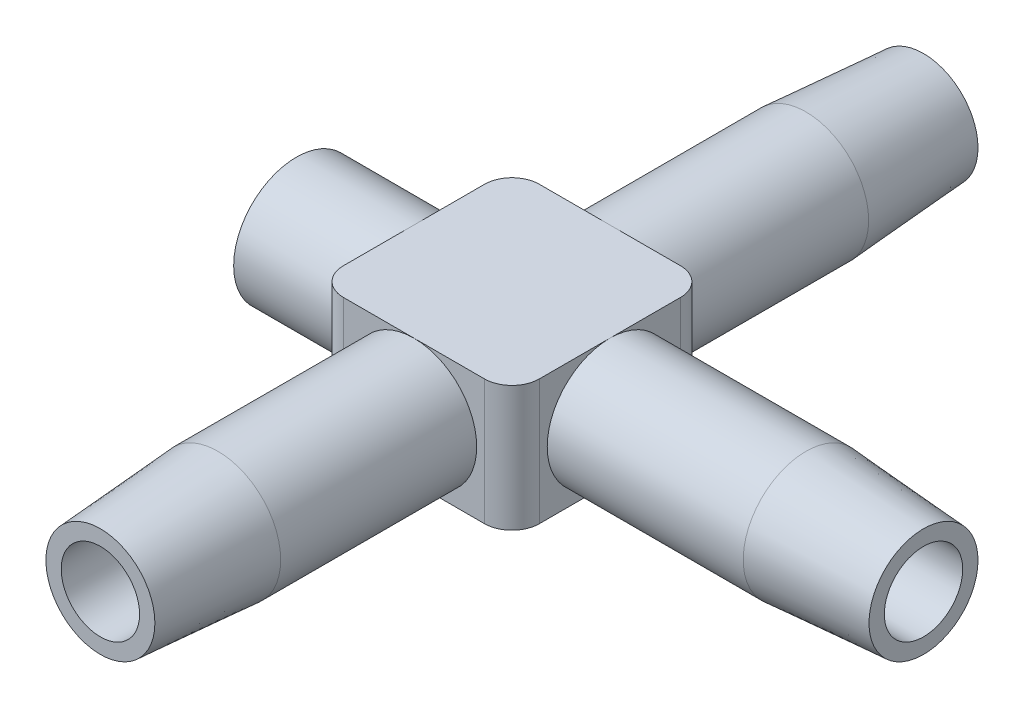
ISO-10303-21;
HEADER;
FILE_DESCRIPTION(('STEP AP214'),'2;1');
FILE_NAME('part.step','',(''),(''),'','','');
FILE_SCHEMA(('AUTOMOTIVE_DESIGN { 1 0 10303 214 1 1 1 1 }'));
ENDSEC;
DATA;
#1=APPLICATION_CONTEXT('core data for automotive mechanical design processes');
#2=APPLICATION_PROTOCOL_DEFINITION('international standard','automotive_design',2000,#1);
#3=PRODUCT_CONTEXT('',#1,'mechanical');
#4=PRODUCT('Part','Part','',(#3));
#5=PRODUCT_RELATED_PRODUCT_CATEGORY('part','',(#4));
#6=PRODUCT_DEFINITION_FORMATION('','',#4);
#7=PRODUCT_DEFINITION_CONTEXT('part definition',#1,'design');
#8=PRODUCT_DEFINITION('design','',#6,#7);
#9=PRODUCT_DEFINITION_SHAPE('','',#8);
#10=(LENGTH_UNIT() NAMED_UNIT(*) SI_UNIT(.MILLI.,.METRE.));
#11=(NAMED_UNIT(*) PLANE_ANGLE_UNIT() SI_UNIT($,.RADIAN.));
#12=(NAMED_UNIT(*) SI_UNIT($,.STERADIAN.) SOLID_ANGLE_UNIT());
#13=UNCERTAINTY_MEASURE_WITH_UNIT(LENGTH_MEASURE(1.E-05),#10,'distance_accuracy_value','');
#14=(GEOMETRIC_REPRESENTATION_CONTEXT(3) GLOBAL_UNCERTAINTY_ASSIGNED_CONTEXT((#13)) GLOBAL_UNIT_ASSIGNED_CONTEXT((#10,
#11,#12)) REPRESENTATION_CONTEXT('',''));
#15=CARTESIAN_POINT('',(0.,0.,0.));
#16=DIRECTION('',(0.,0.,1.));
#17=DIRECTION('',(1.,0.,0.));
#18=AXIS2_PLACEMENT_3D('',#15,#16,#17);
#19=CARTESIAN_POINT('',(-5.,6.4,-5.));
#20=DIRECTION('',(1.,0.,0.));
#21=DIRECTION('',(0.,0.,-1.));
#22=AXIS2_PLACEMENT_3D('',#19,#20,#21);
#23=PLANE('',#22);
#24=CARTESIAN_POINT('',(-5.,3.2,0.));
#25=DIRECTION('',(-1.,0.,0.));
#26=DIRECTION('',(0.,0.,1.));
#27=AXIS2_PLACEMENT_3D('',#24,#25,#26);
#28=CIRCLE('',#27,3.2);
#29=CARTESIAN_POINT('',(-5.,0.,0.));
#30=VERTEX_POINT('',#29);
#31=CARTESIAN_POINT('',(-5.,6.4,0.));
#32=VERTEX_POINT('',#31);
#33=EDGE_CURVE('E155',#30,#32,#28,.T.);
#34=ORIENTED_EDGE('',*,*,#33,.F.);
#35=DIRECTION('',(0.,0.,1.));
#36=VECTOR('',#35,1.);
#37=CARTESIAN_POINT('',(-5.,0.,-5.));
#38=LINE('',#37,#36);
#39=CARTESIAN_POINT('',(-5.,0.,3.6));
#40=VERTEX_POINT('',#39);
#41=EDGE_CURVE('E142',#30,#40,#38,.T.);
#42=ORIENTED_EDGE('',*,*,#41,.T.);
#43=DIRECTION('',(0.,-1.,0.));
#44=VECTOR('',#43,1.);
#45=CARTESIAN_POINT('',(-5.,6.4,3.6));
#46=LINE('',#45,#44);
#47=CARTESIAN_POINT('',(-5.,6.4,3.6));
#48=VERTEX_POINT('',#47);
#49=EDGE_CURVE('E268',#40,#48,#46,.F.);
#50=ORIENTED_EDGE('',*,*,#49,.T.);
#51=DIRECTION('',(0.,0.,1.));
#52=VECTOR('',#51,1.);
#53=CARTESIAN_POINT('',(-5.,6.4,-5.));
#54=LINE('',#53,#52);
#55=EDGE_CURVE('E156',#32,#48,#54,.T.);
#56=ORIENTED_EDGE('',*,*,#55,.F.);
#57=EDGE_LOOP('',(#34,#42,#50,#56));
#58=FACE_BOUND('',#57,.T.);
#59=ADVANCED_FACE('F39',(#58),#23,.F.);
#60=CARTESIAN_POINT('',(-5.,6.4,-5.));
#61=DIRECTION('',(0.,0.,1.));
#62=DIRECTION('',(1.,0.,0.));
#63=AXIS2_PLACEMENT_3D('',#60,#61,#62);
#64=PLANE('',#63);
#65=DIRECTION('',(-1.,0.,0.));
#66=VECTOR('',#65,1.);
#67=CARTESIAN_POINT('',(-5.,0.,-5.));
#68=LINE('',#67,#66);
#69=CARTESIAN_POINT('',(0.,0.,-5.));
#70=VERTEX_POINT('',#69);
#71=CARTESIAN_POINT('',(-3.6,0.,-5.));
#72=VERTEX_POINT('',#71);
#73=EDGE_CURVE('E247',#70,#72,#68,.T.);
#74=ORIENTED_EDGE('',*,*,#73,.T.);
#75=DIRECTION('',(0.,-1.,0.));
#76=VECTOR('',#75,1.);
#77=CARTESIAN_POINT('',(-3.6,6.4,-5.));
#78=LINE('',#77,#76);
#79=CARTESIAN_POINT('',(-3.6,6.4,-5.));
#80=VERTEX_POINT('',#79);
#81=EDGE_CURVE('E283',#72,#80,#78,.F.);
#82=ORIENTED_EDGE('',*,*,#81,.T.);
#83=DIRECTION('',(-1.,0.,0.));
#84=VECTOR('',#83,1.);
#85=CARTESIAN_POINT('',(-5.,6.4,-5.));
#86=LINE('',#85,#84);
#87=CARTESIAN_POINT('',(0.,6.4,-5.));
#88=VERTEX_POINT('',#87);
#89=EDGE_CURVE('E236',#88,#80,#86,.T.);
#90=ORIENTED_EDGE('',*,*,#89,.F.);
#91=CARTESIAN_POINT('',(0.,3.2,-5.));
#92=DIRECTION('',(0.,0.,1.));
#93=DIRECTION('',(1.,0.,0.));
#94=AXIS2_PLACEMENT_3D('',#91,#92,#93);
#95=CIRCLE('',#94,3.2);
#96=EDGE_CURVE('E195',#88,#70,#95,.T.);
#97=ORIENTED_EDGE('',*,*,#96,.T.);
#98=EDGE_LOOP('',(#74,#82,#90,#97));
#99=FACE_BOUND('',#98,.T.);
#100=ADVANCED_FACE('F349',(#99),#64,.F.);
#101=CARTESIAN_POINT('',(5.,6.4,-5.));
#102=DIRECTION('',(-1.,0.,0.));
#103=DIRECTION('',(0.,0.,1.));
#104=AXIS2_PLACEMENT_3D('',#101,#102,#103);
#105=PLANE('',#104);
#106=DIRECTION('',(0.,0.,-1.));
#107=VECTOR('',#106,1.);
#108=CARTESIAN_POINT('',(5.,6.4,-5.));
#109=LINE('',#108,#107);
#110=CARTESIAN_POINT('',(5.,6.4,3.6));
#111=VERTEX_POINT('',#110);
#112=CARTESIAN_POINT('',(5.,6.4,0.));
#113=VERTEX_POINT('',#112);
#114=EDGE_CURVE('E233',#111,#113,#109,.T.);
#115=ORIENTED_EDGE('',*,*,#114,.F.);
#116=DIRECTION('',(0.,-1.,0.));
#117=VECTOR('',#116,1.);
#118=CARTESIAN_POINT('',(5.,6.4,3.6));
#119=LINE('',#118,#117);
#120=CARTESIAN_POINT('',(5.,0.,3.6));
#121=VERTEX_POINT('',#120);
#122=EDGE_CURVE('E48',#111,#121,#119,.T.);
#123=ORIENTED_EDGE('',*,*,#122,.T.);
#124=DIRECTION('',(0.,0.,-1.));
#125=VECTOR('',#124,1.);
#126=CARTESIAN_POINT('',(5.,0.,-5.));
#127=LINE('',#126,#125);
#128=CARTESIAN_POINT('',(5.,0.,0.));
#129=VERTEX_POINT('',#128);
#130=EDGE_CURVE('E244',#121,#129,#127,.T.);
#131=ORIENTED_EDGE('',*,*,#130,.T.);
#132=CARTESIAN_POINT('',(5.,3.2,0.));
#133=DIRECTION('',(1.,0.,0.));
#134=DIRECTION('',(0.,0.,-1.));
#135=AXIS2_PLACEMENT_3D('',#132,#133,#134);
#136=CIRCLE('',#135,3.2);
#137=EDGE_CURVE('E208',#113,#129,#136,.T.);
#138=ORIENTED_EDGE('',*,*,#137,.F.);
#139=EDGE_LOOP('',(#115,#123,#131,#138));
#140=FACE_BOUND('',#139,.T.);
#141=ADVANCED_FACE('F298',(#140),#105,.F.);
#142=CARTESIAN_POINT('',(-5.,6.4,5.));
#143=DIRECTION('',(0.,0.,-1.));
#144=DIRECTION('',(-1.,0.,0.));
#145=AXIS2_PLACEMENT_3D('',#142,#143,#144);
#146=PLANE('',#145);
#147=DIRECTION('',(1.,0.,0.));
#148=VECTOR('',#147,1.);
#149=CARTESIAN_POINT('',(-5.,6.4,5.));
#150=LINE('',#149,#148);
#151=CARTESIAN_POINT('',(-3.6,6.4,5.));
#152=VERTEX_POINT('',#151);
#153=CARTESIAN_POINT('',(0.,6.4,5.));
#154=VERTEX_POINT('',#153);
#155=EDGE_CURVE('E229',#152,#154,#150,.T.);
#156=ORIENTED_EDGE('',*,*,#155,.F.);
#157=DIRECTION('',(0.,-1.,0.));
#158=VECTOR('',#157,1.);
#159=CARTESIAN_POINT('',(-3.6,6.4,5.));
#160=LINE('',#159,#158);
#161=CARTESIAN_POINT('',(-3.6,0.,5.));
#162=VERTEX_POINT('',#161);
#163=EDGE_CURVE('E251',#152,#162,#160,.T.);
#164=ORIENTED_EDGE('',*,*,#163,.T.);
#165=DIRECTION('',(1.,0.,0.));
#166=VECTOR('',#165,1.);
#167=CARTESIAN_POINT('',(-5.,0.,5.));
#168=LINE('',#167,#166);
#169=CARTESIAN_POINT('',(0.,0.,5.));
#170=VERTEX_POINT('',#169);
#171=EDGE_CURVE('E240',#162,#170,#168,.T.);
#172=ORIENTED_EDGE('',*,*,#171,.T.);
#173=CARTESIAN_POINT('',(0.,3.2,5.));
#174=DIRECTION('',(0.,0.,1.));
#175=DIRECTION('',(1.,0.,0.));
#176=AXIS2_PLACEMENT_3D('',#173,#174,#175);
#177=CIRCLE('',#176,3.2);
#178=EDGE_CURVE('E213',#154,#170,#177,.T.);
#179=ORIENTED_EDGE('',*,*,#178,.F.);
#180=EDGE_LOOP('',(#156,#164,#172,#179));
#181=FACE_BOUND('',#180,.T.);
#182=ADVANCED_FACE('F383',(#181),#146,.F.);
#183=EDGE_CURVE('E55',#32,#30,#28,.T.);
#184=ORIENTED_EDGE('',*,*,#183,.F.);
#185=CARTESIAN_POINT('',(-5.,6.4,-3.6));
#186=VERTEX_POINT('',#185);
#187=EDGE_CURVE('E225',#186,#32,#54,.T.);
#188=ORIENTED_EDGE('',*,*,#187,.F.);
#189=DIRECTION('',(0.,-1.,0.));
#190=VECTOR('',#189,1.);
#191=CARTESIAN_POINT('',(-5.,6.4,-3.6));
#192=LINE('',#191,#190);
#193=CARTESIAN_POINT('',(-5.,0.,-3.6));
#194=VERTEX_POINT('',#193);
#195=EDGE_CURVE('E138',#186,#194,#192,.T.);
#196=ORIENTED_EDGE('',*,*,#195,.T.);
#197=EDGE_CURVE('E134',#194,#30,#38,.T.);
#198=ORIENTED_EDGE('',*,*,#197,.T.);
#199=EDGE_LOOP('',(#184,#188,#196,#198));
#200=FACE_BOUND('',#199,.T.);
#201=ADVANCED_FACE('F136',(#200),#23,.F.);
#202=CARTESIAN_POINT('',(3.6,0.,5.));
#203=VERTEX_POINT('',#202);
#204=EDGE_CURVE('E141',#170,#203,#168,.T.);
#205=ORIENTED_EDGE('',*,*,#204,.T.);
#206=DIRECTION('',(0.,-1.,0.));
#207=VECTOR('',#206,1.);
#208=CARTESIAN_POINT('',(3.6,6.4,5.));
#209=LINE('',#208,#207);
#210=CARTESIAN_POINT('',(3.6,6.4,5.));
#211=VERTEX_POINT('',#210);
#212=EDGE_CURVE('E11',#203,#211,#209,.F.);
#213=ORIENTED_EDGE('',*,*,#212,.T.);
#214=EDGE_CURVE('E228',#154,#211,#150,.T.);
#215=ORIENTED_EDGE('',*,*,#214,.F.);
#216=EDGE_CURVE('E224',#170,#154,#177,.T.);
#217=ORIENTED_EDGE('',*,*,#216,.F.);
#218=EDGE_LOOP('',(#205,#213,#215,#217));
#219=FACE_BOUND('',#218,.T.);
#220=ADVANCED_FACE('F326',(#219),#146,.F.);
#221=CARTESIAN_POINT('',(5.,0.,-3.6));
#222=VERTEX_POINT('',#221);
#223=EDGE_CURVE('E243',#129,#222,#127,.T.);
#224=ORIENTED_EDGE('',*,*,#223,.T.);
#225=DIRECTION('',(0.,-1.,0.));
#226=VECTOR('',#225,1.);
#227=CARTESIAN_POINT('',(5.,6.4,-3.6));
#228=LINE('',#227,#226);
#229=CARTESIAN_POINT('',(5.,6.4,-3.6));
#230=VERTEX_POINT('',#229);
#231=EDGE_CURVE('E290',#222,#230,#228,.F.);
#232=ORIENTED_EDGE('',*,*,#231,.T.);
#233=EDGE_CURVE('E232',#113,#230,#109,.T.);
#234=ORIENTED_EDGE('',*,*,#233,.F.);
#235=EDGE_CURVE('E217',#129,#113,#136,.T.);
#236=ORIENTED_EDGE('',*,*,#235,.F.);
#237=EDGE_LOOP('',(#224,#232,#234,#236));
#238=FACE_BOUND('',#237,.T.);
#239=ADVANCED_FACE('F359',(#238),#105,.F.);
#240=CARTESIAN_POINT('',(3.6,6.4,-5.));
#241=VERTEX_POINT('',#240);
#242=EDGE_CURVE('E237',#241,#88,#86,.T.);
#243=ORIENTED_EDGE('',*,*,#242,.F.);
#244=DIRECTION('',(0.,-1.,0.));
#245=VECTOR('',#244,1.);
#246=CARTESIAN_POINT('',(3.6,6.4,-5.));
#247=LINE('',#246,#245);
#248=CARTESIAN_POINT('',(3.6,0.,-5.));
#249=VERTEX_POINT('',#248);
#250=EDGE_CURVE('E286',#241,#249,#247,.T.);
#251=ORIENTED_EDGE('',*,*,#250,.T.);
#252=EDGE_CURVE('E248',#249,#70,#68,.T.);
#253=ORIENTED_EDGE('',*,*,#252,.T.);
#254=EDGE_CURVE('E200',#70,#88,#95,.T.);
#255=ORIENTED_EDGE('',*,*,#254,.T.);
#256=EDGE_LOOP('',(#243,#251,#253,#255));
#257=FACE_BOUND('',#256,.T.);
#258=ADVANCED_FACE('F354',(#257),#64,.F.);
#259=CARTESIAN_POINT('',(0.,6.4,0.));
#260=DIRECTION('',(0.,1.,0.));
#261=DIRECTION('',(0.,0.,1.));
#262=AXIS2_PLACEMENT_3D('',#259,#260,#261);
#263=PLANE('',#262);
#264=ORIENTED_EDGE('',*,*,#187,.T.);
#265=ORIENTED_EDGE('',*,*,#55,.T.);
#266=CARTESIAN_POINT('',(-3.6,6.4,3.6));
#267=DIRECTION('',(0.,1.,0.));
#268=DIRECTION('',(0.,0.,1.));
#269=AXIS2_PLACEMENT_3D('',#266,#267,#268);
#270=CIRCLE('',#269,1.4);
#271=EDGE_CURVE('E280',#48,#152,#270,.T.);
#272=ORIENTED_EDGE('',*,*,#271,.T.);
#273=ORIENTED_EDGE('',*,*,#155,.T.);
#274=ORIENTED_EDGE('',*,*,#214,.T.);
#275=CARTESIAN_POINT('',(3.6,6.4,3.6));
#276=DIRECTION('',(0.,1.,0.));
#277=DIRECTION('',(0.,0.,1.));
#278=AXIS2_PLACEMENT_3D('',#275,#276,#277);
#279=CIRCLE('',#278,1.4);
#280=EDGE_CURVE('E271',#211,#111,#279,.T.);
#281=ORIENTED_EDGE('',*,*,#280,.T.);
#282=ORIENTED_EDGE('',*,*,#114,.T.);
#283=ORIENTED_EDGE('',*,*,#233,.T.);
#284=CARTESIAN_POINT('',(3.6,6.4,-3.6));
#285=DIRECTION('',(0.,1.,0.));
#286=DIRECTION('',(0.,0.,1.));
#287=AXIS2_PLACEMENT_3D('',#284,#285,#286);
#288=CIRCLE('',#287,1.4);
#289=EDGE_CURVE('E274',#230,#241,#288,.T.);
#290=ORIENTED_EDGE('',*,*,#289,.T.);
#291=ORIENTED_EDGE('',*,*,#242,.T.);
#292=ORIENTED_EDGE('',*,*,#89,.T.);
#293=CARTESIAN_POINT('',(-3.6,6.4,-3.6));
#294=DIRECTION('',(0.,1.,0.));
#295=DIRECTION('',(0.,0.,1.));
#296=AXIS2_PLACEMENT_3D('',#293,#294,#295);
#297=CIRCLE('',#296,1.4);
#298=EDGE_CURVE('E277',#80,#186,#297,.T.);
#299=ORIENTED_EDGE('',*,*,#298,.T.);
#300=EDGE_LOOP('',(#264,#265,#272,#273,#274,#281,#282,#283,#290,#291,#292,#299));
#301=FACE_BOUND('',#300,.T.);
#302=ADVANCED_FACE('F341',(#301),#263,.T.);
#303=CARTESIAN_POINT('',(0.,0.,0.));
#304=DIRECTION('',(0.,1.,0.));
#305=DIRECTION('',(0.,0.,1.));
#306=AXIS2_PLACEMENT_3D('',#303,#304,#305);
#307=PLANE('',#306);
#308=ORIENTED_EDGE('',*,*,#171,.F.);
#309=CARTESIAN_POINT('',(-3.6,0.,3.6));
#310=DIRECTION('',(0.,1.,0.));
#311=DIRECTION('',(0.,0.,1.));
#312=AXIS2_PLACEMENT_3D('',#309,#310,#311);
#313=CIRCLE('',#312,1.4);
#314=EDGE_CURVE('E148',#162,#40,#313,.F.);
#315=ORIENTED_EDGE('',*,*,#314,.T.);
#316=ORIENTED_EDGE('',*,*,#41,.F.);
#317=ORIENTED_EDGE('',*,*,#197,.F.);
#318=CARTESIAN_POINT('',(-3.6,0.,-3.6));
#319=DIRECTION('',(0.,1.,0.));
#320=DIRECTION('',(0.,0.,1.));
#321=AXIS2_PLACEMENT_3D('',#318,#319,#320);
#322=CIRCLE('',#321,1.4);
#323=EDGE_CURVE('E261',#194,#72,#322,.F.);
#324=ORIENTED_EDGE('',*,*,#323,.T.);
#325=ORIENTED_EDGE('',*,*,#73,.F.);
#326=ORIENTED_EDGE('',*,*,#252,.F.);
#327=CARTESIAN_POINT('',(3.6,0.,-3.6));
#328=DIRECTION('',(0.,1.,0.));
#329=DIRECTION('',(0.,0.,1.));
#330=AXIS2_PLACEMENT_3D('',#327,#328,#329);
#331=CIRCLE('',#330,1.4);
#332=EDGE_CURVE('E258',#249,#222,#331,.F.);
#333=ORIENTED_EDGE('',*,*,#332,.T.);
#334=ORIENTED_EDGE('',*,*,#223,.F.);
#335=ORIENTED_EDGE('',*,*,#130,.F.);
#336=CARTESIAN_POINT('',(3.6,0.,3.6));
#337=DIRECTION('',(0.,1.,0.));
#338=DIRECTION('',(0.,0.,1.));
#339=AXIS2_PLACEMENT_3D('',#336,#337,#338);
#340=CIRCLE('',#339,1.4);
#341=EDGE_CURVE('E255',#121,#203,#340,.F.);
#342=ORIENTED_EDGE('',*,*,#341,.T.);
#343=ORIENTED_EDGE('',*,*,#204,.F.);
#344=EDGE_LOOP('',(#308,#315,#316,#317,#324,#325,#326,#333,#334,#335,#342,#343));
#345=FACE_BOUND('',#344,.T.);
#346=ADVANCED_FACE('F147',(#345),#307,.F.);
#347=CARTESIAN_POINT('',(0.,3.2,15.));
#348=DIRECTION('',(0.,0.,-1.));
#349=DIRECTION('',(-1.,0.,0.));
#350=AXIS2_PLACEMENT_3D('',#347,#348,#349);
#351=CYLINDRICAL_SURFACE('',#350,3.2);
#352=CARTESIAN_POINT('',(0.,3.2,15.));
#353=DIRECTION('',(0.,0.,1.));
#354=DIRECTION('',(1.,0.,0.));
#355=AXIS2_PLACEMENT_3D('',#352,#353,#354);
#356=CIRCLE('',#355,3.2);
#357=CARTESIAN_POINT('',(3.2,3.2,15.));
#358=VERTEX_POINT('',#357);
#359=EDGE_CURVE('E153',#358,#358,#356,.T.);
#360=ORIENTED_EDGE('',*,*,#359,.F.);
#361=EDGE_LOOP('',(#360));
#362=FACE_BOUND('',#361,.T.);
#363=ORIENTED_EDGE('',*,*,#178,.T.);
#364=ORIENTED_EDGE('',*,*,#216,.T.);
#365=EDGE_LOOP('',(#363,#364));
#366=FACE_BOUND('',#365,.T.);
#367=ADVANCED_FACE('F322',(#362,#366),#351,.T.);
#368=CARTESIAN_POINT('',(15.,3.2,0.));
#369=DIRECTION('',(-1.,0.,0.));
#370=DIRECTION('',(0.,0.,1.));
#371=AXIS2_PLACEMENT_3D('',#368,#369,#370);
#372=CYLINDRICAL_SURFACE('',#371,3.2);
#373=CARTESIAN_POINT('',(15.,3.2,0.));
#374=DIRECTION('',(1.,0.,0.));
#375=DIRECTION('',(0.,0.,-1.));
#376=AXIS2_PLACEMENT_3D('',#373,#374,#375);
#377=CIRCLE('',#376,3.2);
#378=CARTESIAN_POINT('',(15.,3.2,-3.2));
#379=VERTEX_POINT('',#378);
#380=EDGE_CURVE('E209',#379,#379,#377,.T.);
#381=ORIENTED_EDGE('',*,*,#380,.F.);
#382=EDGE_LOOP('',(#381));
#383=FACE_BOUND('',#382,.T.);
#384=ORIENTED_EDGE('',*,*,#137,.T.);
#385=ORIENTED_EDGE('',*,*,#235,.T.);
#386=EDGE_LOOP('',(#384,#385));
#387=FACE_BOUND('',#386,.T.);
#388=ADVANCED_FACE('F313',(#383,#387),#372,.T.);
#389=CARTESIAN_POINT('',(15.,3.2,0.));
#390=DIRECTION('',(-1.,0.,0.));
#391=DIRECTION('',(0.,0.,-1.));
#392=AXIS2_PLACEMENT_3D('',#389,#390,#391);
#393=CONICAL_SURFACE('',#392,3.2,0.0698131700797732);
#394=CARTESIAN_POINT('',(21.,3.2,0.));
#395=DIRECTION('',(1.,0.,0.));
#396=DIRECTION('',(0.,0.,-1.));
#397=AXIS2_PLACEMENT_3D('',#394,#395,#396);
#398=CIRCLE('',#397,2.78043912833894);
#399=CARTESIAN_POINT('',(21.,3.2,-2.78043912833894));
#400=VERTEX_POINT('',#399);
#401=EDGE_CURVE('E204',#400,#400,#398,.T.);
#402=ORIENTED_EDGE('',*,*,#401,.F.);
#403=EDGE_LOOP('',(#402));
#404=FACE_BOUND('',#403,.T.);
#405=ORIENTED_EDGE('',*,*,#380,.T.);
#406=EDGE_LOOP('',(#405));
#407=FACE_BOUND('',#406,.T.);
#408=ADVANCED_FACE('F406',(#404,#407),#393,.T.);
#409=CARTESIAN_POINT('',(21.,3.2,0.));
#410=DIRECTION('',(1.,0.,0.));
#411=DIRECTION('',(0.,0.,-1.));
#412=AXIS2_PLACEMENT_3D('',#409,#410,#411);
#413=PLANE('',#412);
#414=CARTESIAN_POINT('',(21.,3.2,0.));
#415=DIRECTION('',(1.,0.,0.));
#416=DIRECTION('',(0.,0.,-1.));
#417=AXIS2_PLACEMENT_3D('',#414,#415,#416);
#418=CIRCLE('',#417,2.);
#419=CARTESIAN_POINT('',(21.,3.2,-2.));
#420=VERTEX_POINT('',#419);
#421=EDGE_CURVE('E173',#420,#420,#418,.T.);
#422=ORIENTED_EDGE('',*,*,#421,.F.);
#423=EDGE_LOOP('',(#422));
#424=FACE_BOUND('',#423,.T.);
#425=ORIENTED_EDGE('',*,*,#401,.T.);
#426=EDGE_LOOP('',(#425));
#427=FACE_BOUND('',#426,.T.);
#428=ADVANCED_FACE('F410',(#424,#427),#413,.T.);
#429=CARTESIAN_POINT('',(0.,3.2,15.));
#430=DIRECTION('',(0.,0.,-1.));
#431=DIRECTION('',(1.,0.,0.));
#432=AXIS2_PLACEMENT_3D('',#429,#430,#431);
#433=CONICAL_SURFACE('',#432,3.2,0.0698131700797732);
#434=CARTESIAN_POINT('',(0.,3.2,21.));
#435=DIRECTION('',(0.,0.,1.));
#436=DIRECTION('',(1.,0.,0.));
#437=AXIS2_PLACEMENT_3D('',#434,#435,#436);
#438=CIRCLE('',#437,2.78043912833894);
#439=CARTESIAN_POINT('',(2.78043912833894,3.2,21.));
#440=VERTEX_POINT('',#439);
#441=EDGE_CURVE('E199',#440,#440,#438,.T.);
#442=ORIENTED_EDGE('',*,*,#441,.F.);
#443=EDGE_LOOP('',(#442));
#444=FACE_BOUND('',#443,.T.);
#445=ORIENTED_EDGE('',*,*,#359,.T.);
#446=EDGE_LOOP('',(#445));
#447=FACE_BOUND('',#446,.T.);
#448=ADVANCED_FACE('F414',(#444,#447),#433,.T.);
#449=CARTESIAN_POINT('',(0.,3.2,21.));
#450=DIRECTION('',(0.,0.,1.));
#451=DIRECTION('',(1.,0.,0.));
#452=AXIS2_PLACEMENT_3D('',#449,#450,#451);
#453=PLANE('',#452);
#454=CARTESIAN_POINT('',(0.,3.2,21.));
#455=DIRECTION('',(0.,0.,1.));
#456=DIRECTION('',(1.,0.,0.));
#457=AXIS2_PLACEMENT_3D('',#454,#455,#456);
#458=CIRCLE('',#457,2.);
#459=CARTESIAN_POINT('',(2.,3.2,21.));
#460=VERTEX_POINT('',#459);
#461=EDGE_CURVE('E179',#460,#460,#458,.T.);
#462=ORIENTED_EDGE('',*,*,#461,.F.);
#463=EDGE_LOOP('',(#462));
#464=FACE_BOUND('',#463,.T.);
#465=ORIENTED_EDGE('',*,*,#441,.T.);
#466=EDGE_LOOP('',(#465));
#467=FACE_BOUND('',#466,.T.);
#468=ADVANCED_FACE('F418',(#464,#467),#453,.T.);
#469=CARTESIAN_POINT('',(0.,3.2,-15.));
#470=DIRECTION('',(0.,0.,1.));
#471=DIRECTION('',(1.,0.,0.));
#472=AXIS2_PLACEMENT_3D('',#469,#470,#471);
#473=CYLINDRICAL_SURFACE('',#472,3.2);
#474=CARTESIAN_POINT('',(0.,3.2,-15.));
#475=DIRECTION('',(0.,0.,1.));
#476=DIRECTION('',(1.,0.,0.));
#477=AXIS2_PLACEMENT_3D('',#474,#475,#476);
#478=CIRCLE('',#477,3.2);
#479=CARTESIAN_POINT('',(3.2,3.2,-15.));
#480=VERTEX_POINT('',#479);
#481=EDGE_CURVE('E184',#480,#480,#478,.T.);
#482=ORIENTED_EDGE('',*,*,#481,.T.);
#483=EDGE_LOOP('',(#482));
#484=FACE_BOUND('',#483,.T.);
#485=ORIENTED_EDGE('',*,*,#96,.F.);
#486=ORIENTED_EDGE('',*,*,#254,.F.);
#487=EDGE_LOOP('',(#485,#486));
#488=FACE_BOUND('',#487,.T.);
#489=ADVANCED_FACE('F352',(#484,#488),#473,.T.);
#490=CARTESIAN_POINT('',(0.,3.2,-15.));
#491=DIRECTION('',(0.,0.,1.));
#492=DIRECTION('',(1.,0.,0.));
#493=AXIS2_PLACEMENT_3D('',#490,#491,#492);
#494=CONICAL_SURFACE('',#493,3.2,0.0698131700797732);
#495=CARTESIAN_POINT('',(0.,3.2,-21.));
#496=DIRECTION('',(0.,0.,-1.));
#497=DIRECTION('',(-1.,0.,0.));
#498=AXIS2_PLACEMENT_3D('',#495,#496,#497);
#499=CIRCLE('',#498,2.78043912833894);
#500=CARTESIAN_POINT('',(-2.78043912833894,3.2,-21.));
#501=VERTEX_POINT('',#500);
#502=EDGE_CURVE('E191',#501,#501,#499,.F.);
#503=ORIENTED_EDGE('',*,*,#502,.T.);
#504=EDGE_LOOP('',(#503));
#505=FACE_BOUND('',#504,.T.);
#506=ORIENTED_EDGE('',*,*,#481,.F.);
#507=EDGE_LOOP('',(#506));
#508=FACE_BOUND('',#507,.T.);
#509=ADVANCED_FACE('F425',(#505,#508),#494,.T.);
#510=CARTESIAN_POINT('',(0.,3.2,-21.));
#511=DIRECTION('',(0.,0.,-1.));
#512=DIRECTION('',(1.,0.,0.));
#513=AXIS2_PLACEMENT_3D('',#510,#511,#512);
#514=PLANE('',#513);
#515=CARTESIAN_POINT('',(0.,3.2,-21.));
#516=DIRECTION('',(0.,0.,1.));
#517=DIRECTION('',(1.,0.,0.));
#518=AXIS2_PLACEMENT_3D('',#515,#516,#517);
#519=CIRCLE('',#518,2.);
#520=CARTESIAN_POINT('',(2.,3.2,-21.));
#521=VERTEX_POINT('',#520);
#522=EDGE_CURVE('E180',#521,#521,#519,.T.);
#523=ORIENTED_EDGE('',*,*,#522,.T.);
#524=EDGE_LOOP('',(#523));
#525=FACE_BOUND('',#524,.T.);
#526=ORIENTED_EDGE('',*,*,#502,.F.);
#527=EDGE_LOOP('',(#526));
#528=FACE_BOUND('',#527,.T.);
#529=ADVANCED_FACE('F429',(#525,#528),#514,.T.);
#530=CARTESIAN_POINT('',(-3.6,6.4,3.6));
#531=DIRECTION('',(0.,-1.,0.));
#532=DIRECTION('',(0.,0.,-1.));
#533=AXIS2_PLACEMENT_3D('',#530,#531,#532);
#534=CYLINDRICAL_SURFACE('',#533,1.4);
#535=ORIENTED_EDGE('',*,*,#271,.F.);
#536=ORIENTED_EDGE('',*,*,#49,.F.);
#537=ORIENTED_EDGE('',*,*,#314,.F.);
#538=ORIENTED_EDGE('',*,*,#163,.F.);
#539=EDGE_LOOP('',(#535,#536,#537,#538));
#540=FACE_BOUND('',#539,.T.);
#541=ADVANCED_FACE('F432',(#540),#534,.T.);
#542=CARTESIAN_POINT('',(-3.6,6.4,-3.6));
#543=DIRECTION('',(0.,-1.,0.));
#544=DIRECTION('',(0.,0.,-1.));
#545=AXIS2_PLACEMENT_3D('',#542,#543,#544);
#546=CYLINDRICAL_SURFACE('',#545,1.4);
#547=ORIENTED_EDGE('',*,*,#298,.F.);
#548=ORIENTED_EDGE('',*,*,#81,.F.);
#549=ORIENTED_EDGE('',*,*,#323,.F.);
#550=ORIENTED_EDGE('',*,*,#195,.F.);
#551=EDGE_LOOP('',(#547,#548,#549,#550));
#552=FACE_BOUND('',#551,.T.);
#553=ADVANCED_FACE('F347',(#552),#546,.T.);
#554=CARTESIAN_POINT('',(3.6,6.4,-3.6));
#555=DIRECTION('',(0.,-1.,0.));
#556=DIRECTION('',(0.,0.,-1.));
#557=AXIS2_PLACEMENT_3D('',#554,#555,#556);
#558=CYLINDRICAL_SURFACE('',#557,1.4);
#559=ORIENTED_EDGE('',*,*,#289,.F.);
#560=ORIENTED_EDGE('',*,*,#231,.F.);
#561=ORIENTED_EDGE('',*,*,#332,.F.);
#562=ORIENTED_EDGE('',*,*,#250,.F.);
#563=EDGE_LOOP('',(#559,#560,#561,#562));
#564=FACE_BOUND('',#563,.T.);
#565=ADVANCED_FACE('F358',(#564),#558,.T.);
#566=CARTESIAN_POINT('',(3.6,6.4,3.6));
#567=DIRECTION('',(0.,-1.,0.));
#568=DIRECTION('',(0.,0.,-1.));
#569=AXIS2_PLACEMENT_3D('',#566,#567,#568);
#570=CYLINDRICAL_SURFACE('',#569,1.4);
#571=ORIENTED_EDGE('',*,*,#280,.F.);
#572=ORIENTED_EDGE('',*,*,#212,.F.);
#573=ORIENTED_EDGE('',*,*,#341,.F.);
#574=ORIENTED_EDGE('',*,*,#122,.F.);
#575=EDGE_LOOP('',(#571,#572,#573,#574));
#576=FACE_BOUND('',#575,.T.);
#577=ADVANCED_FACE('F41',(#576),#570,.T.);
#578=CARTESIAN_POINT('',(0.,3.2,-21.));
#579=DIRECTION('',(0.,0.,1.));
#580=DIRECTION('',(1.,0.,0.));
#581=AXIS2_PLACEMENT_3D('',#578,#579,#580);
#582=CYLINDRICAL_SURFACE('',#581,2.);
#583=CARTESIAN_POINT('',(0.,3.2,0.));
#584=DIRECTION('',(0.707106781186547,0.,-0.707106781186547));
#585=DIRECTION('',(0.707106781186548,0.,0.707106781186547));
#586=AXIS2_PLACEMENT_3D('',#583,#584,#585);
#587=ELLIPSE('',#586,2.82842712474619,2.);
#588=CARTESIAN_POINT('',(0.,1.2,0.));
#589=VERTEX_POINT('',#588);
#590=CARTESIAN_POINT('',(0.,5.2,0.));
#591=VERTEX_POINT('',#590);
#592=EDGE_CURVE('E167',#589,#591,#587,.F.);
#593=ORIENTED_EDGE('',*,*,#592,.F.);
#594=CARTESIAN_POINT('',(0.,3.2,0.));
#595=DIRECTION('',(0.707106781186548,0.,0.707106781186547));
#596=DIRECTION('',(0.707106781186547,0.,-0.707106781186547));
#597=AXIS2_PLACEMENT_3D('',#594,#595,#596);
#598=ELLIPSE('',#597,2.82842712474619,2.);
#599=EDGE_CURVE('E62',#591,#589,#598,.F.);
#600=ORIENTED_EDGE('',*,*,#599,.F.);
#601=EDGE_LOOP('',(#593,#600));
#602=FACE_BOUND('',#601,.T.);
#603=ORIENTED_EDGE('',*,*,#522,.F.);
#604=EDGE_LOOP('',(#603));
#605=FACE_BOUND('',#604,.T.);
#606=ORIENTED_EDGE('',*,*,#461,.T.);
#607=EDGE_LOOP('',(#606));
#608=FACE_BOUND('',#607,.T.);
#609=ADVANCED_FACE('F361',(#602,#605,#608),#582,.F.);
#610=CARTESIAN_POINT('',(-5.00100000000001,3.2,0.));
#611=DIRECTION('',(1.,0.,0.));
#612=DIRECTION('',(0.,0.,-1.));
#613=AXIS2_PLACEMENT_3D('',#610,#611,#612);
#614=CYLINDRICAL_SURFACE('',#613,2.);
#615=ORIENTED_EDGE('',*,*,#421,.T.);
#616=EDGE_LOOP('',(#615));
#617=FACE_BOUND('',#616,.T.);
#618=ORIENTED_EDGE('',*,*,#599,.T.);
#619=ORIENTED_EDGE('',*,*,#592,.T.);
#620=EDGE_LOOP('',(#618,#619));
#621=FACE_BOUND('',#620,.T.);
#622=ADVANCED_FACE('F366',(#617,#621),#614,.F.);
#623=CARTESIAN_POINT('',(-11.,3.2,0.));
#624=DIRECTION('',(-1.,0.,0.));
#625=DIRECTION('',(0.,0.,1.));
#626=AXIS2_PLACEMENT_3D('',#623,#624,#625);
#627=PLANE('',#626);
#628=CARTESIAN_POINT('',(-11.,3.2,0.));
#629=DIRECTION('',(-1.,0.,0.));
#630=DIRECTION('',(0.,0.,1.));
#631=AXIS2_PLACEMENT_3D('',#628,#629,#630);
#632=CIRCLE('',#631,3.2);
#633=CARTESIAN_POINT('',(-11.,3.2,3.2));
#634=VERTEX_POINT('',#633);
#635=EDGE_CURVE('E164',#634,#634,#632,.T.);
#636=ORIENTED_EDGE('',*,*,#635,.T.);
#637=EDGE_LOOP('',(#636));
#638=FACE_BOUND('',#637,.T.);
#639=CARTESIAN_POINT('',(-11.,3.2,0.));
#640=DIRECTION('',(-1.,0.,0.));
#641=DIRECTION('',(0.,0.,1.));
#642=AXIS2_PLACEMENT_3D('',#639,#640,#641);
#643=CIRCLE('',#642,1.8);
#644=CARTESIAN_POINT('',(-11.,3.2,1.8));
#645=VERTEX_POINT('',#644);
#646=EDGE_CURVE('E160',#645,#645,#643,.T.);
#647=ORIENTED_EDGE('',*,*,#646,.F.);
#648=EDGE_LOOP('',(#647));
#649=FACE_BOUND('',#648,.T.);
#650=ADVANCED_FACE('F437',(#638,#649),#627,.T.);
#651=CARTESIAN_POINT('',(-11.,3.2,0.));
#652=DIRECTION('',(1.,0.,0.));
#653=DIRECTION('',(0.,0.,-1.));
#654=AXIS2_PLACEMENT_3D('',#651,#652,#653);
#655=CYLINDRICAL_SURFACE('',#654,3.2);
#656=ORIENTED_EDGE('',*,*,#635,.F.);
#657=EDGE_LOOP('',(#656));
#658=FACE_BOUND('',#657,.T.);
#659=ORIENTED_EDGE('',*,*,#183,.T.);
#660=ORIENTED_EDGE('',*,*,#33,.T.);
#661=EDGE_LOOP('',(#659,#660));
#662=FACE_BOUND('',#661,.T.);
#663=ADVANCED_FACE('F162',(#658,#662),#655,.T.);
#664=CARTESIAN_POINT('',(-11.,3.2,0.));
#665=DIRECTION('',(1.,0.,0.));
#666=DIRECTION('',(0.,0.,-1.));
#667=AXIS2_PLACEMENT_3D('',#664,#665,#666);
#668=CYLINDRICAL_SURFACE('',#667,1.8);
#669=ORIENTED_EDGE('',*,*,#646,.T.);
#670=EDGE_LOOP('',(#669));
#671=FACE_BOUND('',#670,.T.);
#672=CARTESIAN_POINT('',(-5.,3.2,0.));
#673=DIRECTION('',(-1.,0.,0.));
#674=DIRECTION('',(0.,0.,1.));
#675=AXIS2_PLACEMENT_3D('',#672,#673,#674);
#676=CIRCLE('',#675,1.8);
#677=CARTESIAN_POINT('',(-5.,3.2,1.8));
#678=VERTEX_POINT('',#677);
#679=EDGE_CURVE('E454',#678,#678,#676,.T.);
#680=ORIENTED_EDGE('',*,*,#679,.F.);
#681=EDGE_LOOP('',(#680));
#682=FACE_BOUND('',#681,.T.);
#683=ADVANCED_FACE('F381',(#671,#682),#668,.F.);
#684=ORIENTED_EDGE('',*,*,#679,.T.);
#685=EDGE_LOOP('',(#684));
#686=FACE_BOUND('',#685,.T.);
#687=ADVANCED_FACE('F371',(#686),#23,.F.);
#688=CLOSED_SHELL('',(#59,#100,#141,#182,#201,#220,#239,#258,#302,#346,#367,#388,#408,#428,#448,
#468,#489,#509,#529,#541,#553,#565,#577,#609,#622,#650,#663,#683,#687));
#689=MANIFOLD_SOLID_BREP('B2',#688);
#690=ADVANCED_BREP_SHAPE_REPRESENTATION('',(#18,#689),#14);
#691=SHAPE_DEFINITION_REPRESENTATION(#9,#690);
ENDSEC;
END-ISO-10303-21;
